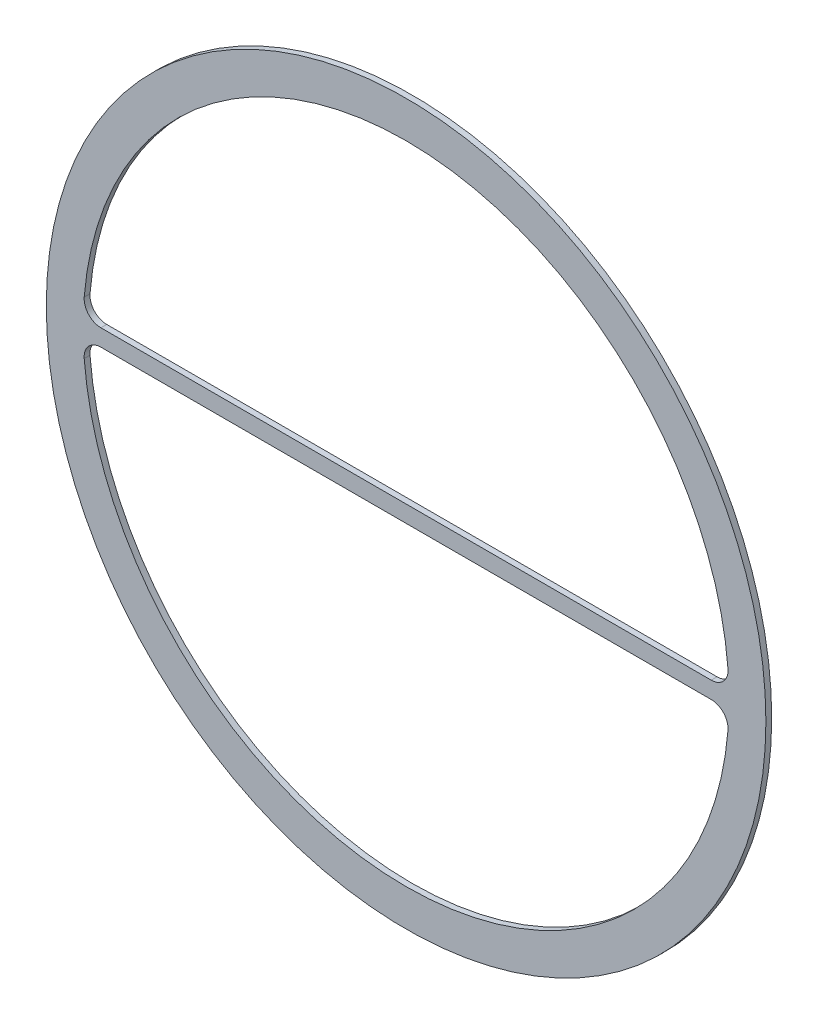
ISO-10303-21;
HEADER;
FILE_DESCRIPTION(('STEP AP214'),'2;1');
FILE_NAME('part.step','',(''),(''),'','','');
FILE_SCHEMA(('AUTOMOTIVE_DESIGN { 1 0 10303 214 1 1 1 1 }'));
ENDSEC;
DATA;
#1=APPLICATION_CONTEXT('core data for automotive mechanical design processes');
#2=APPLICATION_PROTOCOL_DEFINITION('international standard','automotive_design',2000,#1);
#3=PRODUCT_CONTEXT('',#1,'mechanical');
#4=PRODUCT('Part','Part','',(#3));
#5=PRODUCT_RELATED_PRODUCT_CATEGORY('part','',(#4));
#6=PRODUCT_DEFINITION_FORMATION('','',#4);
#7=PRODUCT_DEFINITION_CONTEXT('part definition',#1,'design');
#8=PRODUCT_DEFINITION('design','',#6,#7);
#9=PRODUCT_DEFINITION_SHAPE('','',#8);
#10=(LENGTH_UNIT() NAMED_UNIT(*) SI_UNIT(.MILLI.,.METRE.));
#11=(NAMED_UNIT(*) PLANE_ANGLE_UNIT() SI_UNIT($,.RADIAN.));
#12=(NAMED_UNIT(*) SI_UNIT($,.STERADIAN.) SOLID_ANGLE_UNIT());
#13=UNCERTAINTY_MEASURE_WITH_UNIT(LENGTH_MEASURE(1.E-05),#10,'distance_accuracy_value','');
#14=(GEOMETRIC_REPRESENTATION_CONTEXT(3) GLOBAL_UNCERTAINTY_ASSIGNED_CONTEXT((#13)) GLOBAL_UNIT_ASSIGNED_CONTEXT((#10,
#11,#12)) REPRESENTATION_CONTEXT('',''));
#15=CARTESIAN_POINT('',(0.,0.,0.));
#16=DIRECTION('',(0.,0.,1.));
#17=DIRECTION('',(1.,0.,0.));
#18=AXIS2_PLACEMENT_3D('',#15,#16,#17);
#19=CARTESIAN_POINT('',(0.,0.,4.5));
#20=DIRECTION('',(0.,0.,-1.));
#21=DIRECTION('',(-1.,0.,0.));
#22=AXIS2_PLACEMENT_3D('',#19,#20,#21);
#23=CYLINDRICAL_SURFACE('',#22,250.);
#24=CARTESIAN_POINT('',(0.,0.,4.5));
#25=DIRECTION('',(0.,0.,1.));
#26=DIRECTION('',(1.,0.,0.));
#27=AXIS2_PLACEMENT_3D('',#24,#25,#26);
#28=CIRCLE('',#27,250.);
#29=CARTESIAN_POINT('',(-249.152344405267,-20.5696202531646,4.5));
#30=VERTEX_POINT('',#29);
#31=CARTESIAN_POINT('',(249.152344405267,-20.5696202531646,4.5));
#32=VERTEX_POINT('',#31);
#33=EDGE_CURVE('E177',#30,#32,#28,.T.);
#34=ORIENTED_EDGE('',*,*,#33,.T.);
#35=DIRECTION('',(0.,0.,-1.));
#36=VECTOR('',#35,1.);
#37=CARTESIAN_POINT('',(249.152344405267,-20.5696202531646,4.5));
#38=LINE('',#37,#36);
#39=CARTESIAN_POINT('',(249.152344405267,-20.5696202531646,0.));
#40=VERTEX_POINT('',#39);
#41=EDGE_CURVE('E124',#32,#40,#38,.T.);
#42=ORIENTED_EDGE('',*,*,#41,.T.);
#43=CARTESIAN_POINT('',(0.,0.,0.));
#44=DIRECTION('',(0.,0.,1.));
#45=DIRECTION('',(1.,0.,0.));
#46=AXIS2_PLACEMENT_3D('',#43,#44,#45);
#47=CIRCLE('',#46,250.);
#48=CARTESIAN_POINT('',(-249.152344405267,-20.5696202531646,0.));
#49=VERTEX_POINT('',#48);
#50=EDGE_CURVE('E108',#49,#40,#47,.T.);
#51=ORIENTED_EDGE('',*,*,#50,.F.);
#52=DIRECTION('',(0.,0.,-1.));
#53=VECTOR('',#52,1.);
#54=CARTESIAN_POINT('',(-249.152344405267,-20.5696202531646,4.5));
#55=LINE('',#54,#53);
#56=EDGE_CURVE('E121',#49,#30,#55,.F.);
#57=ORIENTED_EDGE('',*,*,#56,.T.);
#58=EDGE_LOOP('',(#34,#42,#51,#57));
#59=FACE_BOUND('',#58,.T.);
#60=ADVANCED_FACE('F39',(#59),#23,.F.);
#61=CARTESIAN_POINT('',(0.,0.,4.5));
#62=DIRECTION('',(0.,0.,-1.));
#63=DIRECTION('',(-1.,0.,0.));
#64=AXIS2_PLACEMENT_3D('',#61,#62,#63);
#65=CYLINDRICAL_SURFACE('',#64,250.);
#66=CARTESIAN_POINT('',(0.,0.,0.));
#67=DIRECTION('',(0.,0.,1.));
#68=DIRECTION('',(1.,0.,0.));
#69=AXIS2_PLACEMENT_3D('',#66,#67,#68);
#70=CIRCLE('',#69,250.);
#71=CARTESIAN_POINT('',(249.152344405267,20.5696202531646,0.));
#72=VERTEX_POINT('',#71);
#73=CARTESIAN_POINT('',(-249.152344405267,20.5696202531646,0.));
#74=VERTEX_POINT('',#73);
#75=EDGE_CURVE('E163',#72,#74,#70,.T.);
#76=ORIENTED_EDGE('',*,*,#75,.F.);
#77=DIRECTION('',(0.,0.,-1.));
#78=VECTOR('',#77,1.);
#79=CARTESIAN_POINT('',(249.152344405267,20.5696202531646,4.5));
#80=LINE('',#79,#78);
#81=CARTESIAN_POINT('',(249.152344405267,20.5696202531646,4.5));
#82=VERTEX_POINT('',#81);
#83=EDGE_CURVE('E59',#72,#82,#80,.F.);
#84=ORIENTED_EDGE('',*,*,#83,.T.);
#85=CARTESIAN_POINT('',(0.,0.,4.5));
#86=DIRECTION('',(0.,0.,1.));
#87=DIRECTION('',(1.,0.,0.));
#88=AXIS2_PLACEMENT_3D('',#85,#86,#87);
#89=CIRCLE('',#88,250.);
#90=CARTESIAN_POINT('',(-249.152344405267,20.5696202531646,4.5));
#91=VERTEX_POINT('',#90);
#92=EDGE_CURVE('E173',#82,#91,#89,.T.);
#93=ORIENTED_EDGE('',*,*,#92,.T.);
#94=DIRECTION('',(0.,0.,-1.));
#95=VECTOR('',#94,1.);
#96=CARTESIAN_POINT('',(-249.152344405267,20.5696202531646,4.5));
#97=LINE('',#96,#95);
#98=EDGE_CURVE('E148',#91,#74,#97,.T.);
#99=ORIENTED_EDGE('',*,*,#98,.T.);
#100=EDGE_LOOP('',(#76,#84,#93,#99));
#101=FACE_BOUND('',#100,.T.);
#102=ADVANCED_FACE('F172',(#101),#65,.F.);
#103=CARTESIAN_POINT('',(0.,-6.5,4.5));
#104=DIRECTION('',(0.,1.,0.));
#105=DIRECTION('',(0.,0.,1.));
#106=AXIS2_PLACEMENT_3D('',#103,#104,#105);
#107=PLANE('',#106);
#108=DIRECTION('',(1.,0.,0.));
#109=VECTOR('',#108,1.);
#110=CARTESIAN_POINT('',(0.,-6.5,0.));
#111=LINE('',#110,#109);
#112=CARTESIAN_POINT('',(-236.196422496193,-6.5,0.));
#113=VERTEX_POINT('',#112);
#114=CARTESIAN_POINT('',(236.196422496193,-6.5,0.));
#115=VERTEX_POINT('',#114);
#116=EDGE_CURVE('E110',#113,#115,#111,.T.);
#117=ORIENTED_EDGE('',*,*,#116,.T.);
#118=DIRECTION('',(0.,0.,-1.));
#119=VECTOR('',#118,1.);
#120=CARTESIAN_POINT('',(236.196422496193,-6.5,4.5));
#121=LINE('',#120,#119);
#122=CARTESIAN_POINT('',(236.196422496193,-6.5,4.5));
#123=VERTEX_POINT('',#122);
#124=EDGE_CURVE('E141',#115,#123,#121,.F.);
#125=ORIENTED_EDGE('',*,*,#124,.T.);
#126=DIRECTION('',(1.,0.,0.));
#127=VECTOR('',#126,1.);
#128=CARTESIAN_POINT('',(0.,-6.5,4.5));
#129=LINE('',#128,#127);
#130=CARTESIAN_POINT('',(-236.196422496193,-6.5,4.5));
#131=VERTEX_POINT('',#130);
#132=EDGE_CURVE('E134',#131,#123,#129,.T.);
#133=ORIENTED_EDGE('',*,*,#132,.F.);
#134=DIRECTION('',(0.,0.,-1.));
#135=VECTOR('',#134,1.);
#136=CARTESIAN_POINT('',(-236.196422496193,-6.5,4.5));
#137=LINE('',#136,#135);
#138=EDGE_CURVE('E131',#131,#113,#137,.T.);
#139=ORIENTED_EDGE('',*,*,#138,.T.);
#140=EDGE_LOOP('',(#117,#125,#133,#139));
#141=FACE_BOUND('',#140,.T.);
#142=ADVANCED_FACE('F186',(#141),#107,.F.);
#143=CARTESIAN_POINT('',(0.,6.5,4.5));
#144=DIRECTION('',(0.,1.,0.));
#145=DIRECTION('',(0.,0.,1.));
#146=AXIS2_PLACEMENT_3D('',#143,#144,#145);
#147=PLANE('',#146);
#148=DIRECTION('',(1.,0.,0.));
#149=VECTOR('',#148,1.);
#150=CARTESIAN_POINT('',(0.,6.5,4.5));
#151=LINE('',#150,#149);
#152=CARTESIAN_POINT('',(-236.196422496193,6.5,4.5));
#153=VERTEX_POINT('',#152);
#154=CARTESIAN_POINT('',(236.196422496193,6.5,4.5));
#155=VERTEX_POINT('',#154);
#156=EDGE_CURVE('E175',#153,#155,#151,.T.);
#157=ORIENTED_EDGE('',*,*,#156,.T.);
#158=DIRECTION('',(0.,0.,1.));
#159=VECTOR('',#158,1.);
#160=CARTESIAN_POINT('',(236.196422496193,6.5,0.));
#161=LINE('',#160,#159);
#162=CARTESIAN_POINT('',(236.196422496193,6.5,0.));
#163=VERTEX_POINT('',#162);
#164=EDGE_CURVE('E145',#155,#163,#161,.F.);
#165=ORIENTED_EDGE('',*,*,#164,.T.);
#166=DIRECTION('',(1.,0.,0.));
#167=VECTOR('',#166,1.);
#168=CARTESIAN_POINT('',(0.,6.5,0.));
#169=LINE('',#168,#167);
#170=CARTESIAN_POINT('',(-236.196422496193,6.5,0.));
#171=VERTEX_POINT('',#170);
#172=EDGE_CURVE('E125',#171,#163,#169,.T.);
#173=ORIENTED_EDGE('',*,*,#172,.F.);
#174=DIRECTION('',(0.,0.,1.));
#175=VECTOR('',#174,1.);
#176=CARTESIAN_POINT('',(-236.196422496193,6.5,4.5));
#177=LINE('',#176,#175);
#178=EDGE_CURVE('E143',#171,#153,#177,.T.);
#179=ORIENTED_EDGE('',*,*,#178,.T.);
#180=EDGE_LOOP('',(#157,#165,#173,#179));
#181=FACE_BOUND('',#180,.T.);
#182=ADVANCED_FACE('F169',(#181),#147,.T.);
#183=CARTESIAN_POINT('',(0.,0.,4.5));
#184=DIRECTION('',(0.,0.,-1.));
#185=DIRECTION('',(-1.,0.,0.));
#186=AXIS2_PLACEMENT_3D('',#183,#184,#185);
#187=CYLINDRICAL_SURFACE('',#186,278.5);
#188=CARTESIAN_POINT('',(0.,0.,4.5));
#189=DIRECTION('',(0.,0.,1.));
#190=DIRECTION('',(1.,0.,0.));
#191=AXIS2_PLACEMENT_3D('',#188,#189,#190);
#192=CIRCLE('',#191,278.5);
#193=CARTESIAN_POINT('',(278.5,0.,4.5));
#194=VERTEX_POINT('',#193);
#195=EDGE_CURVE('E129',#194,#194,#192,.T.);
#196=ORIENTED_EDGE('',*,*,#195,.F.);
#197=EDGE_LOOP('',(#196));
#198=FACE_BOUND('',#197,.T.);
#199=CARTESIAN_POINT('',(0.,0.,0.));
#200=DIRECTION('',(0.,0.,1.));
#201=DIRECTION('',(1.,0.,0.));
#202=AXIS2_PLACEMENT_3D('',#199,#200,#201);
#203=CIRCLE('',#202,278.5);
#204=CARTESIAN_POINT('',(278.5,0.,0.));
#205=VERTEX_POINT('',#204);
#206=EDGE_CURVE('E137',#205,#205,#203,.T.);
#207=ORIENTED_EDGE('',*,*,#206,.T.);
#208=EDGE_LOOP('',(#207));
#209=FACE_BOUND('',#208,.T.);
#210=ADVANCED_FACE('F195',(#198,#209),#187,.T.);
#211=CARTESIAN_POINT('',(0.,0.,4.5));
#212=DIRECTION('',(0.,0.,1.));
#213=DIRECTION('',(1.,0.,0.));
#214=AXIS2_PLACEMENT_3D('',#211,#212,#213);
#215=PLANE('',#214);
#216=ORIENTED_EDGE('',*,*,#92,.F.);
#217=CARTESIAN_POINT('',(236.196422496193,19.5,4.5));
#218=DIRECTION('',(0.,0.,1.));
#219=DIRECTION('',(1.,0.,0.));
#220=AXIS2_PLACEMENT_3D('',#217,#218,#219);
#221=CIRCLE('',#220,13.);
#222=EDGE_CURVE('E116',#82,#155,#221,.F.);
#223=ORIENTED_EDGE('',*,*,#222,.T.);
#224=ORIENTED_EDGE('',*,*,#156,.F.);
#225=CARTESIAN_POINT('',(-236.196422496193,19.5,4.5));
#226=DIRECTION('',(0.,0.,1.));
#227=DIRECTION('',(1.,0.,0.));
#228=AXIS2_PLACEMENT_3D('',#225,#226,#227);
#229=CIRCLE('',#228,13.);
#230=EDGE_CURVE('E11',#153,#91,#229,.F.);
#231=ORIENTED_EDGE('',*,*,#230,.T.);
#232=EDGE_LOOP('',(#216,#223,#224,#231));
#233=FACE_BOUND('',#232,.T.);
#234=ORIENTED_EDGE('',*,*,#33,.F.);
#235=CARTESIAN_POINT('',(-236.196422496193,-19.5,4.5));
#236=DIRECTION('',(0.,0.,1.));
#237=DIRECTION('',(1.,0.,0.));
#238=AXIS2_PLACEMENT_3D('',#235,#236,#237);
#239=CIRCLE('',#238,13.);
#240=EDGE_CURVE('E115',#30,#131,#239,.F.);
#241=ORIENTED_EDGE('',*,*,#240,.T.);
#242=ORIENTED_EDGE('',*,*,#132,.T.);
#243=CARTESIAN_POINT('',(236.196422496193,-19.5,4.5));
#244=DIRECTION('',(0.,0.,1.));
#245=DIRECTION('',(1.,0.,0.));
#246=AXIS2_PLACEMENT_3D('',#243,#244,#245);
#247=CIRCLE('',#246,13.);
#248=EDGE_CURVE('E154',#123,#32,#247,.F.);
#249=ORIENTED_EDGE('',*,*,#248,.T.);
#250=EDGE_LOOP('',(#234,#241,#242,#249));
#251=FACE_BOUND('',#250,.T.);
#252=ORIENTED_EDGE('',*,*,#195,.T.);
#253=EDGE_LOOP('',(#252));
#254=FACE_BOUND('',#253,.T.);
#255=ADVANCED_FACE('F192',(#233,#251,#254),#215,.T.);
#256=CARTESIAN_POINT('',(0.,0.,0.));
#257=DIRECTION('',(0.,0.,1.));
#258=DIRECTION('',(1.,0.,0.));
#259=AXIS2_PLACEMENT_3D('',#256,#257,#258);
#260=PLANE('',#259);
#261=ORIENTED_EDGE('',*,*,#172,.T.);
#262=CARTESIAN_POINT('',(236.196422496193,19.5,0.));
#263=DIRECTION('',(0.,0.,1.));
#264=DIRECTION('',(1.,0.,0.));
#265=AXIS2_PLACEMENT_3D('',#262,#263,#264);
#266=CIRCLE('',#265,13.);
#267=EDGE_CURVE('E156',#163,#72,#266,.T.);
#268=ORIENTED_EDGE('',*,*,#267,.T.);
#269=ORIENTED_EDGE('',*,*,#75,.T.);
#270=CARTESIAN_POINT('',(-236.196422496193,19.5,0.));
#271=DIRECTION('',(0.,0.,1.));
#272=DIRECTION('',(1.,0.,0.));
#273=AXIS2_PLACEMENT_3D('',#270,#271,#272);
#274=CIRCLE('',#273,13.);
#275=EDGE_CURVE('E47',#74,#171,#274,.T.);
#276=ORIENTED_EDGE('',*,*,#275,.T.);
#277=EDGE_LOOP('',(#261,#268,#269,#276));
#278=FACE_BOUND('',#277,.T.);
#279=ORIENTED_EDGE('',*,*,#116,.F.);
#280=CARTESIAN_POINT('',(-236.196422496193,-19.5,0.));
#281=DIRECTION('',(0.,0.,1.));
#282=DIRECTION('',(1.,0.,0.));
#283=AXIS2_PLACEMENT_3D('',#280,#281,#282);
#284=CIRCLE('',#283,13.);
#285=EDGE_CURVE('E104',#113,#49,#284,.T.);
#286=ORIENTED_EDGE('',*,*,#285,.T.);
#287=ORIENTED_EDGE('',*,*,#50,.T.);
#288=CARTESIAN_POINT('',(236.196422496193,-19.5,0.));
#289=DIRECTION('',(0.,0.,1.));
#290=DIRECTION('',(1.,0.,0.));
#291=AXIS2_PLACEMENT_3D('',#288,#289,#290);
#292=CIRCLE('',#291,13.);
#293=EDGE_CURVE('E152',#40,#115,#292,.T.);
#294=ORIENTED_EDGE('',*,*,#293,.T.);
#295=EDGE_LOOP('',(#279,#286,#287,#294));
#296=FACE_BOUND('',#295,.T.);
#297=ORIENTED_EDGE('',*,*,#206,.F.);
#298=EDGE_LOOP('',(#297));
#299=FACE_BOUND('',#298,.T.);
#300=ADVANCED_FACE('F106',(#278,#296,#299),#260,.F.);
#301=CARTESIAN_POINT('',(236.196422496193,-19.5,4.5));
#302=DIRECTION('',(0.,0.,-1.));
#303=DIRECTION('',(-1.,0.,0.));
#304=AXIS2_PLACEMENT_3D('',#301,#302,#303);
#305=CYLINDRICAL_SURFACE('',#304,13.);
#306=ORIENTED_EDGE('',*,*,#248,.F.);
#307=ORIENTED_EDGE('',*,*,#124,.F.);
#308=ORIENTED_EDGE('',*,*,#293,.F.);
#309=ORIENTED_EDGE('',*,*,#41,.F.);
#310=EDGE_LOOP('',(#306,#307,#308,#309));
#311=FACE_BOUND('',#310,.T.);
#312=ADVANCED_FACE('F190',(#311),#305,.F.);
#313=CARTESIAN_POINT('',(236.196422496193,19.5,4.5));
#314=DIRECTION('',(0.,0.,-1.));
#315=DIRECTION('',(-1.,0.,0.));
#316=AXIS2_PLACEMENT_3D('',#313,#314,#315);
#317=CYLINDRICAL_SURFACE('',#316,13.);
#318=ORIENTED_EDGE('',*,*,#222,.F.);
#319=ORIENTED_EDGE('',*,*,#83,.F.);
#320=ORIENTED_EDGE('',*,*,#267,.F.);
#321=ORIENTED_EDGE('',*,*,#164,.F.);
#322=EDGE_LOOP('',(#318,#319,#320,#321));
#323=FACE_BOUND('',#322,.T.);
#324=ADVANCED_FACE('F208',(#323),#317,.F.);
#325=CARTESIAN_POINT('',(-236.196422496193,-19.5,4.5));
#326=DIRECTION('',(0.,0.,-1.));
#327=DIRECTION('',(-1.,0.,0.));
#328=AXIS2_PLACEMENT_3D('',#325,#326,#327);
#329=CYLINDRICAL_SURFACE('',#328,13.);
#330=ORIENTED_EDGE('',*,*,#240,.F.);
#331=ORIENTED_EDGE('',*,*,#56,.F.);
#332=ORIENTED_EDGE('',*,*,#285,.F.);
#333=ORIENTED_EDGE('',*,*,#138,.F.);
#334=EDGE_LOOP('',(#330,#331,#332,#333));
#335=FACE_BOUND('',#334,.T.);
#336=ADVANCED_FACE('F128',(#335),#329,.F.);
#337=CARTESIAN_POINT('',(-236.196422496193,19.5,4.5));
#338=DIRECTION('',(0.,0.,-1.));
#339=DIRECTION('',(-1.,0.,0.));
#340=AXIS2_PLACEMENT_3D('',#337,#338,#339);
#341=CYLINDRICAL_SURFACE('',#340,13.);
#342=ORIENTED_EDGE('',*,*,#230,.F.);
#343=ORIENTED_EDGE('',*,*,#178,.F.);
#344=ORIENTED_EDGE('',*,*,#275,.F.);
#345=ORIENTED_EDGE('',*,*,#98,.F.);
#346=EDGE_LOOP('',(#342,#343,#344,#345));
#347=FACE_BOUND('',#346,.T.);
#348=ADVANCED_FACE('F41',(#347),#341,.F.);
#349=CLOSED_SHELL('',(#60,#102,#142,#182,#210,#255,#300,#312,#324,#336,#348));
#350=MANIFOLD_SOLID_BREP('B2',#349);
#351=ADVANCED_BREP_SHAPE_REPRESENTATION('',(#18,#350),#14);
#352=SHAPE_DEFINITION_REPRESENTATION(#9,#351);
ENDSEC;
END-ISO-10303-21;
